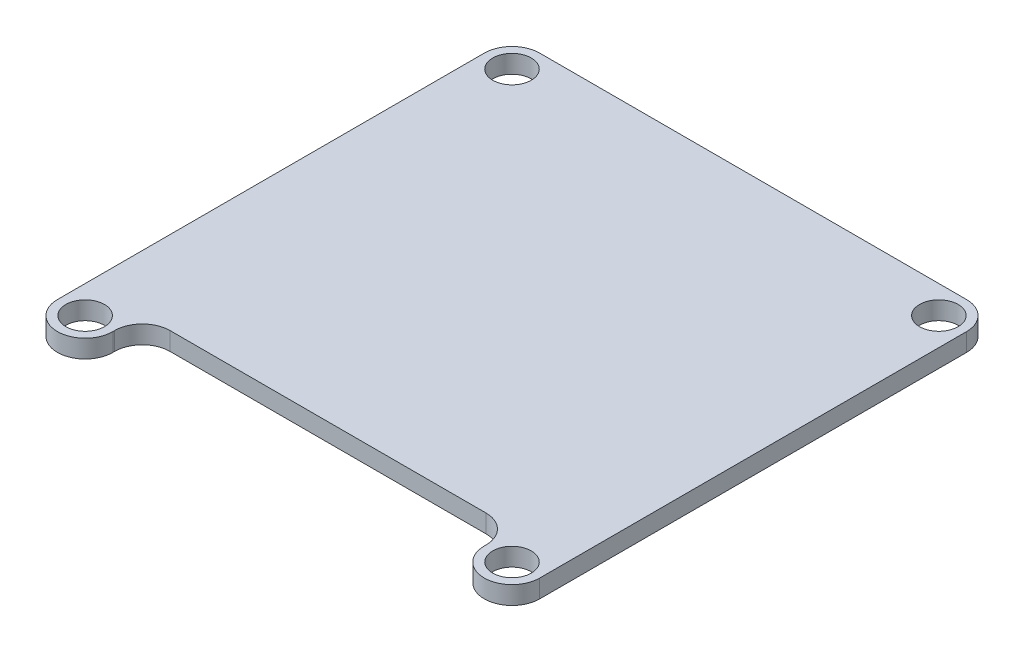
ISO-10303-21;
HEADER;
FILE_DESCRIPTION(('STEP AP214'),'2;1');
FILE_NAME('part.step','',(''),(''),'','','');
FILE_SCHEMA(('AUTOMOTIVE_DESIGN { 1 0 10303 214 1 1 1 1 }'));
ENDSEC;
DATA;
#1=APPLICATION_CONTEXT('core data for automotive mechanical design processes');
#2=APPLICATION_PROTOCOL_DEFINITION('international standard','automotive_design',2000,#1);
#3=PRODUCT_CONTEXT('',#1,'mechanical');
#4=PRODUCT('Part','Part','',(#3));
#5=PRODUCT_RELATED_PRODUCT_CATEGORY('part','',(#4));
#6=PRODUCT_DEFINITION_FORMATION('','',#4);
#7=PRODUCT_DEFINITION_CONTEXT('part definition',#1,'design');
#8=PRODUCT_DEFINITION('design','',#6,#7);
#9=PRODUCT_DEFINITION_SHAPE('','',#8);
#10=(LENGTH_UNIT() NAMED_UNIT(*) SI_UNIT(.MILLI.,.METRE.));
#11=(NAMED_UNIT(*) PLANE_ANGLE_UNIT() SI_UNIT($,.RADIAN.));
#12=(NAMED_UNIT(*) SI_UNIT($,.STERADIAN.) SOLID_ANGLE_UNIT());
#13=UNCERTAINTY_MEASURE_WITH_UNIT(LENGTH_MEASURE(1.E-05),#10,'distance_accuracy_value','');
#14=(GEOMETRIC_REPRESENTATION_CONTEXT(3) GLOBAL_UNCERTAINTY_ASSIGNED_CONTEXT((#13)) GLOBAL_UNIT_ASSIGNED_CONTEXT((#10,
#11,#12)) REPRESENTATION_CONTEXT('',''));
#15=CARTESIAN_POINT('',(0.,0.,0.));
#16=DIRECTION('',(0.,0.,1.));
#17=DIRECTION('',(1.,0.,0.));
#18=AXIS2_PLACEMENT_3D('',#15,#16,#17);
#19=CARTESIAN_POINT('',(-16.644019138756,1.5,24.877033492823));
#20=DIRECTION('',(-1.,0.,0.));
#21=DIRECTION('',(0.,0.,1.));
#22=AXIS2_PLACEMENT_3D('',#19,#20,#21);
#23=PLANE('',#22);
#24=DIRECTION('',(0.,0.,-1.));
#25=VECTOR('',#24,1.);
#26=CARTESIAN_POINT('',(-16.644019138756,0.,24.877033492823));
#27=LINE('',#26,#25);
#28=CARTESIAN_POINT('',(-16.644019138756,0.,24.877033492823));
#29=VERTEX_POINT('',#28);
#30=CARTESIAN_POINT('',(-16.644019138756,0.,24.7337171492357));
#31=VERTEX_POINT('',#30);
#32=EDGE_CURVE('E157',#29,#31,#27,.T.);
#33=ORIENTED_EDGE('',*,*,#32,.T.);
#34=DIRECTION('',(0.,-1.,0.));
#35=VECTOR('',#34,1.);
#36=CARTESIAN_POINT('',(-16.644019138756,1.5,24.7337171492357));
#37=LINE('',#36,#35);
#38=CARTESIAN_POINT('',(-16.644019138756,1.5,24.7337171492357));
#39=VERTEX_POINT('',#38);
#40=EDGE_CURVE('E41',#39,#31,#37,.T.);
#41=ORIENTED_EDGE('',*,*,#40,.F.);
#42=DIRECTION('',(0.,0.,-1.));
#43=VECTOR('',#42,1.);
#44=CARTESIAN_POINT('',(-16.644019138756,1.5,24.877033492823));
#45=LINE('',#44,#43);
#46=CARTESIAN_POINT('',(-16.644019138756,1.5,24.877033492823));
#47=VERTEX_POINT('',#46);
#48=EDGE_CURVE('E105',#47,#39,#45,.T.);
#49=ORIENTED_EDGE('',*,*,#48,.F.);
#50=DIRECTION('',(0.,-1.,0.));
#51=VECTOR('',#50,1.);
#52=CARTESIAN_POINT('',(-16.644019138756,1.5,24.877033492823));
#53=LINE('',#52,#51);
#54=EDGE_CURVE('E11',#47,#29,#53,.T.);
#55=ORIENTED_EDGE('',*,*,#54,.T.);
#56=EDGE_LOOP('',(#33,#41,#49,#55));
#57=FACE_BOUND('',#56,.T.);
#58=ADVANCED_FACE('F33',(#57),#23,.F.);
#59=CARTESIAN_POINT('',(-14.344019138756,1.5,24.7337171492357));
#60=DIRECTION('',(0.,-1.,0.));
#61=DIRECTION('',(0.,0.,-1.));
#62=AXIS2_PLACEMENT_3D('',#59,#60,#61);
#63=CYLINDRICAL_SURFACE('',#62,2.3);
#64=CARTESIAN_POINT('',(-14.344019138756,0.,24.7337171492357));
#65=DIRECTION('',(0.,-1.,0.));
#66=DIRECTION('',(0.,0.,1.));
#67=AXIS2_PLACEMENT_3D('',#64,#65,#66);
#68=CIRCLE('',#67,2.3);
#69=CARTESIAN_POINT('',(-14.344019138756,0.,22.4337171492357));
#70=VERTEX_POINT('',#69);
#71=EDGE_CURVE('E159',#31,#70,#68,.T.);
#72=ORIENTED_EDGE('',*,*,#71,.T.);
#73=DIRECTION('',(0.,-1.,0.));
#74=VECTOR('',#73,1.);
#75=CARTESIAN_POINT('',(-14.344019138756,1.5,22.4337171492357));
#76=LINE('',#75,#74);
#77=CARTESIAN_POINT('',(-14.344019138756,1.5,22.4337171492357));
#78=VERTEX_POINT('',#77);
#79=EDGE_CURVE('E198',#78,#70,#76,.T.);
#80=ORIENTED_EDGE('',*,*,#79,.F.);
#81=CARTESIAN_POINT('',(-14.344019138756,1.5,24.7337171492357));
#82=DIRECTION('',(0.,-1.,0.));
#83=DIRECTION('',(0.,0.,1.));
#84=AXIS2_PLACEMENT_3D('',#81,#82,#83);
#85=CIRCLE('',#84,2.3);
#86=EDGE_CURVE('E206',#39,#78,#85,.T.);
#87=ORIENTED_EDGE('',*,*,#86,.F.);
#88=ORIENTED_EDGE('',*,*,#40,.T.);
#89=EDGE_LOOP('',(#72,#80,#87,#88));
#90=FACE_BOUND('',#89,.T.);
#91=ADVANCED_FACE('F204',(#90),#63,.F.);
#92=CARTESIAN_POINT('',(-14.344019138756,1.5,22.4337171492357));
#93=DIRECTION('',(0.,0.,-1.));
#94=DIRECTION('',(-1.,0.,0.));
#95=AXIS2_PLACEMENT_3D('',#92,#93,#94);
#96=PLANE('',#95);
#97=DIRECTION('',(1.,0.,0.));
#98=VECTOR('',#97,1.);
#99=CARTESIAN_POINT('',(-14.344019138756,0.,22.4337171492357));
#100=LINE('',#99,#98);
#101=CARTESIAN_POINT('',(11.855980861244,0.,22.4337171492357));
#102=VERTEX_POINT('',#101);
#103=EDGE_CURVE('E162',#70,#102,#100,.T.);
#104=ORIENTED_EDGE('',*,*,#103,.T.);
#105=DIRECTION('',(0.,-1.,0.));
#106=VECTOR('',#105,1.);
#107=CARTESIAN_POINT('',(11.855980861244,1.5,22.4337171492357));
#108=LINE('',#107,#106);
#109=CARTESIAN_POINT('',(11.855980861244,1.5,22.4337171492357));
#110=VERTEX_POINT('',#109);
#111=EDGE_CURVE('E195',#110,#102,#108,.T.);
#112=ORIENTED_EDGE('',*,*,#111,.F.);
#113=DIRECTION('',(1.,0.,0.));
#114=VECTOR('',#113,1.);
#115=CARTESIAN_POINT('',(-14.344019138756,1.5,22.4337171492357));
#116=LINE('',#115,#114);
#117=EDGE_CURVE('E225',#78,#110,#116,.T.);
#118=ORIENTED_EDGE('',*,*,#117,.F.);
#119=ORIENTED_EDGE('',*,*,#79,.T.);
#120=EDGE_LOOP('',(#104,#112,#118,#119));
#121=FACE_BOUND('',#120,.T.);
#122=ADVANCED_FACE('F216',(#121),#96,.F.);
#123=CARTESIAN_POINT('',(11.855980861244,1.5,24.7337171492357));
#124=DIRECTION('',(0.,-1.,0.));
#125=DIRECTION('',(0.,0.,-1.));
#126=AXIS2_PLACEMENT_3D('',#123,#124,#125);
#127=CYLINDRICAL_SURFACE('',#126,2.3);
#128=CARTESIAN_POINT('',(11.855980861244,0.,24.7337171492357));
#129=DIRECTION('',(0.,-1.,0.));
#130=DIRECTION('',(0.,0.,-1.));
#131=AXIS2_PLACEMENT_3D('',#128,#129,#130);
#132=CIRCLE('',#131,2.3);
#133=CARTESIAN_POINT('',(14.155980861244,0.,24.7337171492357));
#134=VERTEX_POINT('',#133);
#135=EDGE_CURVE('E164',#102,#134,#132,.T.);
#136=ORIENTED_EDGE('',*,*,#135,.T.);
#137=DIRECTION('',(0.,-1.,0.));
#138=VECTOR('',#137,1.);
#139=CARTESIAN_POINT('',(14.155980861244,1.5,24.7337171492357));
#140=LINE('',#139,#138);
#141=CARTESIAN_POINT('',(14.155980861244,1.5,24.7337171492357));
#142=VERTEX_POINT('',#141);
#143=EDGE_CURVE('E192',#142,#134,#140,.T.);
#144=ORIENTED_EDGE('',*,*,#143,.F.);
#145=CARTESIAN_POINT('',(11.855980861244,1.5,24.7337171492357));
#146=DIRECTION('',(0.,-1.,0.));
#147=DIRECTION('',(0.,0.,-1.));
#148=AXIS2_PLACEMENT_3D('',#145,#146,#147);
#149=CIRCLE('',#148,2.3);
#150=EDGE_CURVE('E222',#110,#142,#149,.T.);
#151=ORIENTED_EDGE('',*,*,#150,.F.);
#152=ORIENTED_EDGE('',*,*,#111,.T.);
#153=EDGE_LOOP('',(#136,#144,#151,#152));
#154=FACE_BOUND('',#153,.T.);
#155=ADVANCED_FACE('F220',(#154),#127,.F.);
#156=CARTESIAN_POINT('',(14.155980861244,1.5,24.877033492823));
#157=DIRECTION('',(1.,0.,0.));
#158=DIRECTION('',(0.,0.,-1.));
#159=AXIS2_PLACEMENT_3D('',#156,#157,#158);
#160=PLANE('',#159);
#161=DIRECTION('',(0.,0.,1.));
#162=VECTOR('',#161,1.);
#163=CARTESIAN_POINT('',(14.155980861244,0.,24.877033492823));
#164=LINE('',#163,#162);
#165=CARTESIAN_POINT('',(14.155980861244,0.,24.877033492823));
#166=VERTEX_POINT('',#165);
#167=EDGE_CURVE('E166',#134,#166,#164,.T.);
#168=ORIENTED_EDGE('',*,*,#167,.T.);
#169=DIRECTION('',(0.,-1.,0.));
#170=VECTOR('',#169,1.);
#171=CARTESIAN_POINT('',(14.155980861244,1.5,24.877033492823));
#172=LINE('',#171,#170);
#173=CARTESIAN_POINT('',(14.155980861244,1.5,24.877033492823));
#174=VERTEX_POINT('',#173);
#175=EDGE_CURVE('E189',#174,#166,#172,.T.);
#176=ORIENTED_EDGE('',*,*,#175,.F.);
#177=DIRECTION('',(0.,0.,1.));
#178=VECTOR('',#177,1.);
#179=CARTESIAN_POINT('',(14.155980861244,1.5,24.877033492823));
#180=LINE('',#179,#178);
#181=EDGE_CURVE('E224',#142,#174,#180,.T.);
#182=ORIENTED_EDGE('',*,*,#181,.F.);
#183=ORIENTED_EDGE('',*,*,#143,.T.);
#184=EDGE_LOOP('',(#168,#176,#182,#183));
#185=FACE_BOUND('',#184,.T.);
#186=ADVANCED_FACE('F310',(#185),#160,.F.);
#187=CARTESIAN_POINT('',(16.455980861244,1.5,24.877033492823));
#188=DIRECTION('',(0.,-1.,0.));
#189=DIRECTION('',(0.,0.,-1.));
#190=AXIS2_PLACEMENT_3D('',#187,#188,#189);
#191=CYLINDRICAL_SURFACE('',#190,2.3);
#192=CARTESIAN_POINT('',(16.455980861244,0.,24.877033492823));
#193=DIRECTION('',(0.,1.,0.));
#194=DIRECTION('',(0.,0.,1.));
#195=AXIS2_PLACEMENT_3D('',#192,#193,#194);
#196=CIRCLE('',#195,2.3);
#197=CARTESIAN_POINT('',(18.755980861244,0.,24.877033492823));
#198=VERTEX_POINT('',#197);
#199=EDGE_CURVE('E169',#166,#198,#196,.T.);
#200=ORIENTED_EDGE('',*,*,#199,.T.);
#201=DIRECTION('',(0.,-1.,0.));
#202=VECTOR('',#201,1.);
#203=CARTESIAN_POINT('',(18.755980861244,1.5,24.877033492823));
#204=LINE('',#203,#202);
#205=CARTESIAN_POINT('',(18.755980861244,1.5,24.877033492823));
#206=VERTEX_POINT('',#205);
#207=EDGE_CURVE('E186',#206,#198,#204,.T.);
#208=ORIENTED_EDGE('',*,*,#207,.F.);
#209=CARTESIAN_POINT('',(16.455980861244,1.5,24.877033492823));
#210=DIRECTION('',(0.,1.,0.));
#211=DIRECTION('',(0.,0.,-1.));
#212=AXIS2_PLACEMENT_3D('',#209,#210,#211);
#213=CIRCLE('',#212,2.3);
#214=EDGE_CURVE('E227',#174,#206,#213,.T.);
#215=ORIENTED_EDGE('',*,*,#214,.F.);
#216=ORIENTED_EDGE('',*,*,#175,.T.);
#217=EDGE_LOOP('',(#200,#208,#215,#216));
#218=FACE_BOUND('',#217,.T.);
#219=ADVANCED_FACE('F313',(#218),#191,.T.);
#220=CARTESIAN_POINT('',(18.755980861244,1.5,-10.522966507177));
#221=DIRECTION('',(-1.,0.,0.));
#222=DIRECTION('',(0.,0.,1.));
#223=AXIS2_PLACEMENT_3D('',#220,#221,#222);
#224=PLANE('',#223);
#225=DIRECTION('',(0.,0.,-1.));
#226=VECTOR('',#225,1.);
#227=CARTESIAN_POINT('',(18.755980861244,0.,-10.522966507177));
#228=LINE('',#227,#226);
#229=CARTESIAN_POINT('',(18.755980861244,0.,-10.522966507177));
#230=VERTEX_POINT('',#229);
#231=EDGE_CURVE('E171',#198,#230,#228,.T.);
#232=ORIENTED_EDGE('',*,*,#231,.T.);
#233=DIRECTION('',(0.,-1.,0.));
#234=VECTOR('',#233,1.);
#235=CARTESIAN_POINT('',(18.755980861244,1.5,-10.522966507177));
#236=LINE('',#235,#234);
#237=CARTESIAN_POINT('',(18.755980861244,1.5,-10.522966507177));
#238=VERTEX_POINT('',#237);
#239=EDGE_CURVE('E183',#238,#230,#236,.T.);
#240=ORIENTED_EDGE('',*,*,#239,.F.);
#241=DIRECTION('',(0.,0.,-1.));
#242=VECTOR('',#241,1.);
#243=CARTESIAN_POINT('',(18.755980861244,1.5,-10.522966507177));
#244=LINE('',#243,#242);
#245=EDGE_CURVE('E233',#206,#238,#244,.T.);
#246=ORIENTED_EDGE('',*,*,#245,.F.);
#247=ORIENTED_EDGE('',*,*,#207,.T.);
#248=EDGE_LOOP('',(#232,#240,#246,#247));
#249=FACE_BOUND('',#248,.T.);
#250=ADVANCED_FACE('F239',(#249),#224,.F.);
#251=CARTESIAN_POINT('',(16.455980861244,1.5,-10.522966507177));
#252=DIRECTION('',(0.,-1.,0.));
#253=DIRECTION('',(0.,0.,-1.));
#254=AXIS2_PLACEMENT_3D('',#251,#252,#253);
#255=CYLINDRICAL_SURFACE('',#254,2.3);
#256=CARTESIAN_POINT('',(16.455980861244,0.,-10.522966507177));
#257=DIRECTION('',(0.,1.,0.));
#258=DIRECTION('',(0.,0.,1.));
#259=AXIS2_PLACEMENT_3D('',#256,#257,#258);
#260=CIRCLE('',#259,2.3);
#261=CARTESIAN_POINT('',(16.455980861244,0.,-12.822966507177));
#262=VERTEX_POINT('',#261);
#263=EDGE_CURVE('E173',#230,#262,#260,.T.);
#264=ORIENTED_EDGE('',*,*,#263,.T.);
#265=DIRECTION('',(0.,-1.,0.));
#266=VECTOR('',#265,1.);
#267=CARTESIAN_POINT('',(16.455980861244,1.5,-12.822966507177));
#268=LINE('',#267,#266);
#269=CARTESIAN_POINT('',(16.455980861244,1.5,-12.822966507177));
#270=VERTEX_POINT('',#269);
#271=EDGE_CURVE('E146',#270,#262,#268,.T.);
#272=ORIENTED_EDGE('',*,*,#271,.F.);
#273=CARTESIAN_POINT('',(16.455980861244,1.5,-10.522966507177));
#274=DIRECTION('',(0.,1.,0.));
#275=DIRECTION('',(0.,0.,1.));
#276=AXIS2_PLACEMENT_3D('',#273,#274,#275);
#277=CIRCLE('',#276,2.3);
#278=EDGE_CURVE('E137',#238,#270,#277,.T.);
#279=ORIENTED_EDGE('',*,*,#278,.F.);
#280=ORIENTED_EDGE('',*,*,#239,.T.);
#281=EDGE_LOOP('',(#264,#272,#279,#280));
#282=FACE_BOUND('',#281,.T.);
#283=ADVANCED_FACE('F243',(#282),#255,.T.);
#284=CARTESIAN_POINT('',(-18.944019138756,1.5,-12.822966507177));
#285=DIRECTION('',(0.,0.,1.));
#286=DIRECTION('',(1.,0.,0.));
#287=AXIS2_PLACEMENT_3D('',#284,#285,#286);
#288=PLANE('',#287);
#289=DIRECTION('',(-1.,0.,0.));
#290=VECTOR('',#289,1.);
#291=CARTESIAN_POINT('',(-18.944019138756,0.,-12.822966507177));
#292=LINE('',#291,#290);
#293=CARTESIAN_POINT('',(-18.944019138756,0.,-12.822966507177));
#294=VERTEX_POINT('',#293);
#295=EDGE_CURVE('E145',#262,#294,#292,.T.);
#296=ORIENTED_EDGE('',*,*,#295,.T.);
#297=DIRECTION('',(0.,-1.,0.));
#298=VECTOR('',#297,1.);
#299=CARTESIAN_POINT('',(-18.944019138756,1.5,-12.822966507177));
#300=LINE('',#299,#298);
#301=CARTESIAN_POINT('',(-18.944019138756,1.5,-12.822966507177));
#302=VERTEX_POINT('',#301);
#303=EDGE_CURVE('E142',#302,#294,#300,.T.);
#304=ORIENTED_EDGE('',*,*,#303,.F.);
#305=DIRECTION('',(-1.,0.,0.));
#306=VECTOR('',#305,1.);
#307=CARTESIAN_POINT('',(-18.944019138756,1.5,-12.822966507177));
#308=LINE('',#307,#306);
#309=EDGE_CURVE('E131',#270,#302,#308,.T.);
#310=ORIENTED_EDGE('',*,*,#309,.F.);
#311=ORIENTED_EDGE('',*,*,#271,.T.);
#312=EDGE_LOOP('',(#296,#304,#310,#311));
#313=FACE_BOUND('',#312,.T.);
#314=ADVANCED_FACE('F143',(#313),#288,.F.);
#315=CARTESIAN_POINT('',(-18.944019138756,1.5,-10.522966507177));
#316=DIRECTION('',(0.,-1.,0.));
#317=DIRECTION('',(0.,0.,-1.));
#318=AXIS2_PLACEMENT_3D('',#315,#316,#317);
#319=CYLINDRICAL_SURFACE('',#318,2.3);
#320=CARTESIAN_POINT('',(-18.944019138756,0.,-10.522966507177));
#321=DIRECTION('',(0.,1.,0.));
#322=DIRECTION('',(0.,0.,-1.));
#323=AXIS2_PLACEMENT_3D('',#320,#321,#322);
#324=CIRCLE('',#323,2.3);
#325=CARTESIAN_POINT('',(-21.244019138756,0.,-10.522966507177));
#326=VERTEX_POINT('',#325);
#327=EDGE_CURVE('E91',#294,#326,#324,.T.);
#328=ORIENTED_EDGE('',*,*,#327,.T.);
#329=DIRECTION('',(0.,-1.,0.));
#330=VECTOR('',#329,1.);
#331=CARTESIAN_POINT('',(-21.244019138756,1.5,-10.522966507177));
#332=LINE('',#331,#330);
#333=CARTESIAN_POINT('',(-21.244019138756,1.5,-10.522966507177));
#334=VERTEX_POINT('',#333);
#335=EDGE_CURVE('E147',#334,#326,#332,.T.);
#336=ORIENTED_EDGE('',*,*,#335,.F.);
#337=CARTESIAN_POINT('',(-18.944019138756,1.5,-10.522966507177));
#338=DIRECTION('',(0.,1.,0.));
#339=DIRECTION('',(0.,0.,-1.));
#340=AXIS2_PLACEMENT_3D('',#337,#338,#339);
#341=CIRCLE('',#340,2.3);
#342=EDGE_CURVE('E135',#302,#334,#341,.T.);
#343=ORIENTED_EDGE('',*,*,#342,.F.);
#344=ORIENTED_EDGE('',*,*,#303,.T.);
#345=EDGE_LOOP('',(#328,#336,#343,#344));
#346=FACE_BOUND('',#345,.T.);
#347=ADVANCED_FACE('F149',(#346),#319,.T.);
#348=CARTESIAN_POINT('',(-21.244019138756,1.5,-10.522966507177));
#349=DIRECTION('',(1.,0.,0.));
#350=DIRECTION('',(0.,0.,-1.));
#351=AXIS2_PLACEMENT_3D('',#348,#349,#350);
#352=PLANE('',#351);
#353=DIRECTION('',(0.,0.,1.));
#354=VECTOR('',#353,1.);
#355=CARTESIAN_POINT('',(-21.244019138756,0.,-10.522966507177));
#356=LINE('',#355,#354);
#357=CARTESIAN_POINT('',(-21.244019138756,0.,24.877033492823));
#358=VERTEX_POINT('',#357);
#359=EDGE_CURVE('E98',#326,#358,#356,.T.);
#360=ORIENTED_EDGE('',*,*,#359,.T.);
#361=DIRECTION('',(0.,-1.,0.));
#362=VECTOR('',#361,1.);
#363=CARTESIAN_POINT('',(-21.244019138756,1.5,24.877033492823));
#364=LINE('',#363,#362);
#365=CARTESIAN_POINT('',(-21.244019138756,1.5,24.877033492823));
#366=VERTEX_POINT('',#365);
#367=EDGE_CURVE('E153',#366,#358,#364,.T.);
#368=ORIENTED_EDGE('',*,*,#367,.F.);
#369=DIRECTION('',(0.,0.,1.));
#370=VECTOR('',#369,1.);
#371=CARTESIAN_POINT('',(-21.244019138756,1.5,-10.522966507177));
#372=LINE('',#371,#370);
#373=EDGE_CURVE('E151',#334,#366,#372,.T.);
#374=ORIENTED_EDGE('',*,*,#373,.F.);
#375=ORIENTED_EDGE('',*,*,#335,.T.);
#376=EDGE_LOOP('',(#360,#368,#374,#375));
#377=FACE_BOUND('',#376,.T.);
#378=ADVANCED_FACE('F245',(#377),#352,.F.);
#379=CARTESIAN_POINT('',(-18.944019138756,1.5,24.877033492823));
#380=DIRECTION('',(0.,-1.,0.));
#381=DIRECTION('',(0.,0.,-1.));
#382=AXIS2_PLACEMENT_3D('',#379,#380,#381);
#383=CYLINDRICAL_SURFACE('',#382,2.3);
#384=CARTESIAN_POINT('',(-18.944019138756,0.,24.877033492823));
#385=DIRECTION('',(0.,1.,0.));
#386=DIRECTION('',(0.,0.,-1.));
#387=AXIS2_PLACEMENT_3D('',#384,#385,#386);
#388=CIRCLE('',#387,2.3);
#389=EDGE_CURVE('E178',#358,#29,#388,.T.);
#390=ORIENTED_EDGE('',*,*,#389,.T.);
#391=ORIENTED_EDGE('',*,*,#54,.F.);
#392=CARTESIAN_POINT('',(-18.944019138756,1.5,24.877033492823));
#393=DIRECTION('',(0.,1.,0.));
#394=DIRECTION('',(0.,0.,1.));
#395=AXIS2_PLACEMENT_3D('',#392,#393,#394);
#396=CIRCLE('',#395,2.3);
#397=EDGE_CURVE('E49',#366,#47,#396,.T.);
#398=ORIENTED_EDGE('',*,*,#397,.F.);
#399=ORIENTED_EDGE('',*,*,#367,.T.);
#400=EDGE_LOOP('',(#390,#391,#398,#399));
#401=FACE_BOUND('',#400,.T.);
#402=ADVANCED_FACE('F244',(#401),#383,.T.);
#403=CARTESIAN_POINT('',(-18.944019138756,1.5,24.877033492823));
#404=DIRECTION('',(0.,1.,0.));
#405=DIRECTION('',(0.,0.,1.));
#406=AXIS2_PLACEMENT_3D('',#403,#404,#405);
#407=PLANE('',#406);
#408=CARTESIAN_POINT('',(-18.944019138756,1.5,-10.522966507177));
#409=DIRECTION('',(0.,1.,0.));
#410=DIRECTION('',(0.,0.,1.));
#411=AXIS2_PLACEMENT_3D('',#408,#409,#410);
#412=CIRCLE('',#411,1.6);
#413=CARTESIAN_POINT('',(-18.944019138756,1.5,-8.92296650717702));
#414=VERTEX_POINT('',#413);
#415=EDGE_CURVE('E269',#414,#414,#412,.T.);
#416=ORIENTED_EDGE('',*,*,#415,.F.);
#417=EDGE_LOOP('',(#416));
#418=FACE_BOUND('',#417,.T.);
#419=CARTESIAN_POINT('',(16.455980861244,1.5,-10.522966507177));
#420=DIRECTION('',(0.,1.,0.));
#421=DIRECTION('',(0.,0.,1.));
#422=AXIS2_PLACEMENT_3D('',#419,#420,#421);
#423=CIRCLE('',#422,1.6);
#424=CARTESIAN_POINT('',(16.455980861244,1.5,-8.92296650717702));
#425=VERTEX_POINT('',#424);
#426=EDGE_CURVE('E263',#425,#425,#423,.T.);
#427=ORIENTED_EDGE('',*,*,#426,.F.);
#428=EDGE_LOOP('',(#427));
#429=FACE_BOUND('',#428,.T.);
#430=CARTESIAN_POINT('',(16.455980861244,1.5,24.877033492823));
#431=DIRECTION('',(0.,1.,0.));
#432=DIRECTION('',(0.,0.,1.));
#433=AXIS2_PLACEMENT_3D('',#430,#431,#432);
#434=CIRCLE('',#433,1.6);
#435=CARTESIAN_POINT('',(16.455980861244,1.5,26.477033492823));
#436=VERTEX_POINT('',#435);
#437=EDGE_CURVE('E257',#436,#436,#434,.T.);
#438=ORIENTED_EDGE('',*,*,#437,.F.);
#439=EDGE_LOOP('',(#438));
#440=FACE_BOUND('',#439,.T.);
#441=CARTESIAN_POINT('',(-18.944019138756,1.5,24.877033492823));
#442=DIRECTION('',(0.,1.,0.));
#443=DIRECTION('',(0.,0.,1.));
#444=AXIS2_PLACEMENT_3D('',#441,#442,#443);
#445=CIRCLE('',#444,1.6);
#446=CARTESIAN_POINT('',(-18.944019138756,1.5,26.477033492823));
#447=VERTEX_POINT('',#446);
#448=EDGE_CURVE('E251',#447,#447,#445,.T.);
#449=ORIENTED_EDGE('',*,*,#448,.F.);
#450=EDGE_LOOP('',(#449));
#451=FACE_BOUND('',#450,.T.);
#452=ORIENTED_EDGE('',*,*,#397,.T.);
#453=ORIENTED_EDGE('',*,*,#48,.T.);
#454=ORIENTED_EDGE('',*,*,#86,.T.);
#455=ORIENTED_EDGE('',*,*,#117,.T.);
#456=ORIENTED_EDGE('',*,*,#150,.T.);
#457=ORIENTED_EDGE('',*,*,#181,.T.);
#458=ORIENTED_EDGE('',*,*,#214,.T.);
#459=ORIENTED_EDGE('',*,*,#245,.T.);
#460=ORIENTED_EDGE('',*,*,#278,.T.);
#461=ORIENTED_EDGE('',*,*,#309,.T.);
#462=ORIENTED_EDGE('',*,*,#342,.T.);
#463=ORIENTED_EDGE('',*,*,#373,.T.);
#464=EDGE_LOOP('',(#452,#453,#454,#455,#456,#457,#458,#459,#460,#461,#462,#463));
#465=FACE_BOUND('',#464,.T.);
#466=ADVANCED_FACE('F133',(#418,#429,#440,#451,#465),#407,.T.);
#467=CARTESIAN_POINT('',(-18.944019138756,0.,24.877033492823));
#468=DIRECTION('',(0.,1.,0.));
#469=DIRECTION('',(0.,0.,1.));
#470=AXIS2_PLACEMENT_3D('',#467,#468,#469);
#471=PLANE('',#470);
#472=CARTESIAN_POINT('',(-18.944019138756,0.,-10.522966507177));
#473=DIRECTION('',(0.,1.,0.));
#474=DIRECTION('',(0.,0.,1.));
#475=AXIS2_PLACEMENT_3D('',#472,#473,#474);
#476=CIRCLE('',#475,1.6);
#477=CARTESIAN_POINT('',(-18.944019138756,0.,-8.92296650717702));
#478=VERTEX_POINT('',#477);
#479=EDGE_CURVE('E266',#478,#478,#476,.T.);
#480=ORIENTED_EDGE('',*,*,#479,.T.);
#481=EDGE_LOOP('',(#480));
#482=FACE_BOUND('',#481,.T.);
#483=CARTESIAN_POINT('',(16.455980861244,0.,-10.522966507177));
#484=DIRECTION('',(0.,1.,0.));
#485=DIRECTION('',(0.,0.,1.));
#486=AXIS2_PLACEMENT_3D('',#483,#484,#485);
#487=CIRCLE('',#486,1.6);
#488=CARTESIAN_POINT('',(16.455980861244,0.,-8.92296650717702));
#489=VERTEX_POINT('',#488);
#490=EDGE_CURVE('E260',#489,#489,#487,.T.);
#491=ORIENTED_EDGE('',*,*,#490,.T.);
#492=EDGE_LOOP('',(#491));
#493=FACE_BOUND('',#492,.T.);
#494=CARTESIAN_POINT('',(16.455980861244,0.,24.877033492823));
#495=DIRECTION('',(0.,1.,0.));
#496=DIRECTION('',(0.,0.,1.));
#497=AXIS2_PLACEMENT_3D('',#494,#495,#496);
#498=CIRCLE('',#497,1.6);
#499=CARTESIAN_POINT('',(16.455980861244,0.,26.477033492823));
#500=VERTEX_POINT('',#499);
#501=EDGE_CURVE('E254',#500,#500,#498,.T.);
#502=ORIENTED_EDGE('',*,*,#501,.T.);
#503=EDGE_LOOP('',(#502));
#504=FACE_BOUND('',#503,.T.);
#505=CARTESIAN_POINT('',(-18.944019138756,0.,24.877033492823));
#506=DIRECTION('',(0.,1.,0.));
#507=DIRECTION('',(0.,0.,1.));
#508=AXIS2_PLACEMENT_3D('',#505,#506,#507);
#509=CIRCLE('',#508,1.6);
#510=CARTESIAN_POINT('',(-18.944019138756,0.,26.477033492823));
#511=VERTEX_POINT('',#510);
#512=EDGE_CURVE('E160',#511,#511,#509,.T.);
#513=ORIENTED_EDGE('',*,*,#512,.T.);
#514=EDGE_LOOP('',(#513));
#515=FACE_BOUND('',#514,.T.);
#516=ORIENTED_EDGE('',*,*,#32,.F.);
#517=ORIENTED_EDGE('',*,*,#389,.F.);
#518=ORIENTED_EDGE('',*,*,#359,.F.);
#519=ORIENTED_EDGE('',*,*,#327,.F.);
#520=ORIENTED_EDGE('',*,*,#295,.F.);
#521=ORIENTED_EDGE('',*,*,#263,.F.);
#522=ORIENTED_EDGE('',*,*,#231,.F.);
#523=ORIENTED_EDGE('',*,*,#199,.F.);
#524=ORIENTED_EDGE('',*,*,#167,.F.);
#525=ORIENTED_EDGE('',*,*,#135,.F.);
#526=ORIENTED_EDGE('',*,*,#103,.F.);
#527=ORIENTED_EDGE('',*,*,#71,.F.);
#528=EDGE_LOOP('',(#516,#517,#518,#519,#520,#521,#522,#523,#524,#525,#526,#527));
#529=FACE_BOUND('',#528,.T.);
#530=ADVANCED_FACE('F210',(#482,#493,#504,#515,#529),#471,.F.);
#531=CARTESIAN_POINT('',(-18.944019138756,1.5,24.877033492823));
#532=DIRECTION('',(0.,1.,0.));
#533=DIRECTION('',(0.,0.,1.));
#534=AXIS2_PLACEMENT_3D('',#531,#532,#533);
#535=CYLINDRICAL_SURFACE('',#534,1.6);
#536=ORIENTED_EDGE('',*,*,#512,.F.);
#537=EDGE_LOOP('',(#536));
#538=FACE_BOUND('',#537,.T.);
#539=ORIENTED_EDGE('',*,*,#448,.T.);
#540=EDGE_LOOP('',(#539));
#541=FACE_BOUND('',#540,.T.);
#542=ADVANCED_FACE('F284',(#538,#541),#535,.F.);
#543=CARTESIAN_POINT('',(16.455980861244,1.5,24.877033492823));
#544=DIRECTION('',(0.,1.,0.));
#545=DIRECTION('',(0.,0.,1.));
#546=AXIS2_PLACEMENT_3D('',#543,#544,#545);
#547=CYLINDRICAL_SURFACE('',#546,1.6);
#548=ORIENTED_EDGE('',*,*,#501,.F.);
#549=EDGE_LOOP('',(#548));
#550=FACE_BOUND('',#549,.T.);
#551=ORIENTED_EDGE('',*,*,#437,.T.);
#552=EDGE_LOOP('',(#551));
#553=FACE_BOUND('',#552,.T.);
#554=ADVANCED_FACE('F286',(#550,#553),#547,.F.);
#555=CARTESIAN_POINT('',(16.455980861244,1.5,-10.522966507177));
#556=DIRECTION('',(0.,1.,0.));
#557=DIRECTION('',(0.,0.,1.));
#558=AXIS2_PLACEMENT_3D('',#555,#556,#557);
#559=CYLINDRICAL_SURFACE('',#558,1.6);
#560=ORIENTED_EDGE('',*,*,#490,.F.);
#561=EDGE_LOOP('',(#560));
#562=FACE_BOUND('',#561,.T.);
#563=ORIENTED_EDGE('',*,*,#426,.T.);
#564=EDGE_LOOP('',(#563));
#565=FACE_BOUND('',#564,.T.);
#566=ADVANCED_FACE('F293',(#562,#565),#559,.F.);
#567=CARTESIAN_POINT('',(-18.944019138756,1.5,-10.522966507177));
#568=DIRECTION('',(0.,1.,0.));
#569=DIRECTION('',(0.,0.,1.));
#570=AXIS2_PLACEMENT_3D('',#567,#568,#569);
#571=CYLINDRICAL_SURFACE('',#570,1.6);
#572=ORIENTED_EDGE('',*,*,#479,.F.);
#573=EDGE_LOOP('',(#572));
#574=FACE_BOUND('',#573,.T.);
#575=ORIENTED_EDGE('',*,*,#415,.T.);
#576=EDGE_LOOP('',(#575));
#577=FACE_BOUND('',#576,.T.);
#578=ADVANCED_FACE('F273',(#574,#577),#571,.F.);
#579=CLOSED_SHELL('',(#58,#91,#122,#155,#186,#219,#250,#283,#314,#347,#378,#402,#466,#530,#542,
#554,#566,#578));
#580=MANIFOLD_SOLID_BREP('B2',#579);
#581=ADVANCED_BREP_SHAPE_REPRESENTATION('',(#18,#580),#14);
#582=SHAPE_DEFINITION_REPRESENTATION(#9,#581);
ENDSEC;
END-ISO-10303-21;
